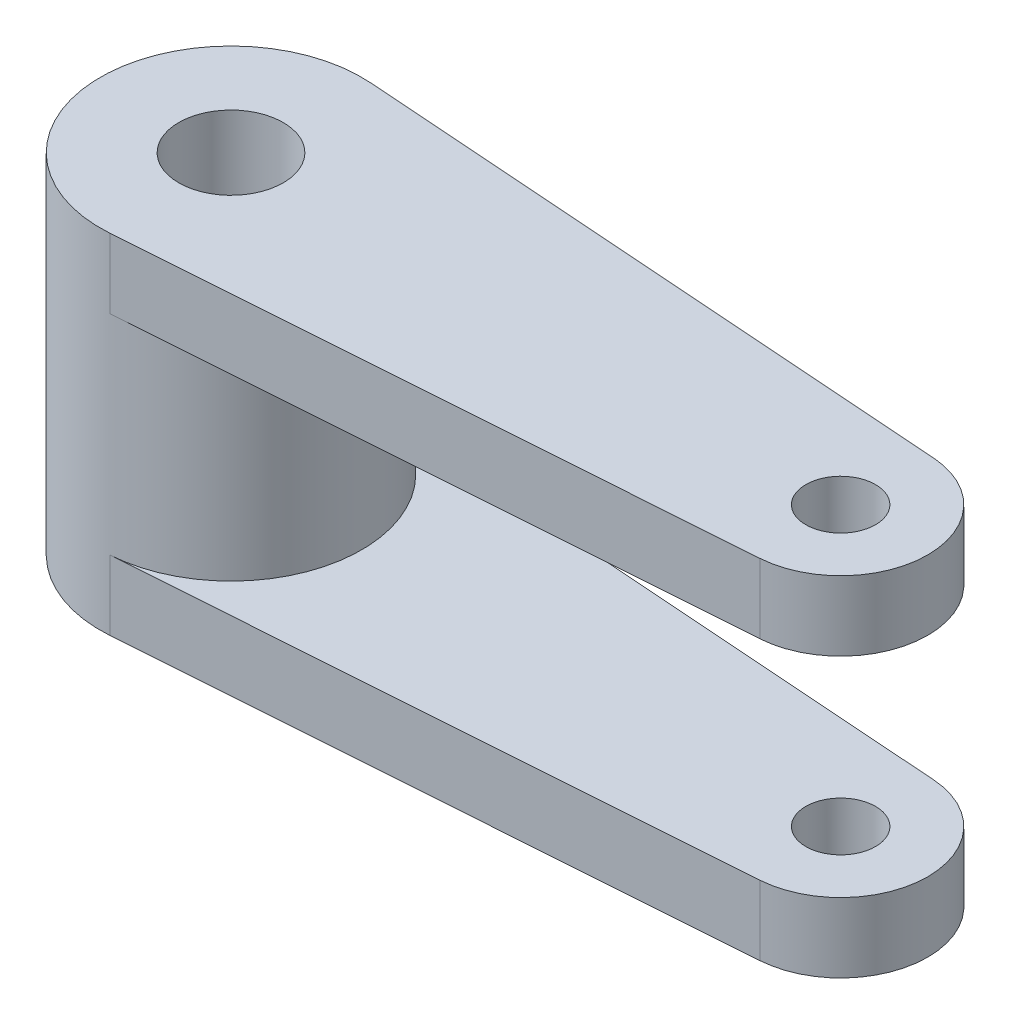
ISO-10303-21;
HEADER;
FILE_DESCRIPTION(('STEP AP214'),'2;1');
FILE_NAME('part.step','',(''),(''),'','','');
FILE_SCHEMA(('AUTOMOTIVE_DESIGN { 1 0 10303 214 1 1 1 1 }'));
ENDSEC;
DATA;
#1=APPLICATION_CONTEXT('core data for automotive mechanical design processes');
#2=APPLICATION_PROTOCOL_DEFINITION('international standard','automotive_design',2000,#1);
#3=PRODUCT_CONTEXT('',#1,'mechanical');
#4=PRODUCT('Part','Part','',(#3));
#5=PRODUCT_RELATED_PRODUCT_CATEGORY('part','',(#4));
#6=PRODUCT_DEFINITION_FORMATION('','',#4);
#7=PRODUCT_DEFINITION_CONTEXT('part definition',#1,'design');
#8=PRODUCT_DEFINITION('design','',#6,#7);
#9=PRODUCT_DEFINITION_SHAPE('','',#8);
#10=(LENGTH_UNIT() NAMED_UNIT(*) SI_UNIT(.MILLI.,.METRE.));
#11=(NAMED_UNIT(*) PLANE_ANGLE_UNIT() SI_UNIT($,.RADIAN.));
#12=(NAMED_UNIT(*) SI_UNIT($,.STERADIAN.) SOLID_ANGLE_UNIT());
#13=UNCERTAINTY_MEASURE_WITH_UNIT(LENGTH_MEASURE(1.E-05),#10,'distance_accuracy_value','');
#14=(GEOMETRIC_REPRESENTATION_CONTEXT(3) GLOBAL_UNCERTAINTY_ASSIGNED_CONTEXT((#13)) GLOBAL_UNIT_ASSIGNED_CONTEXT((#10,
#11,#12)) REPRESENTATION_CONTEXT('',''));
#15=CARTESIAN_POINT('',(0.,0.,0.));
#16=DIRECTION('',(0.,0.,1.));
#17=DIRECTION('',(1.,0.,0.));
#18=AXIS2_PLACEMENT_3D('',#15,#16,#17);
#19=CARTESIAN_POINT('',(0.,20.,0.));
#20=DIRECTION('',(0.,-1.,0.));
#21=DIRECTION('',(0.,0.,-1.));
#22=AXIS2_PLACEMENT_3D('',#19,#20,#21);
#23=CYLINDRICAL_SURFACE('',#22,15.);
#24=CARTESIAN_POINT('',(0.,20.,0.));
#25=DIRECTION('',(0.,1.,0.));
#26=DIRECTION('',(0.,0.,1.));
#27=AXIS2_PLACEMENT_3D('',#24,#25,#26);
#28=CIRCLE('',#27,15.);
#29=CARTESIAN_POINT('',(1.07142857142857,20.,-14.961685761181));
#30=VERTEX_POINT('',#29);
#31=CARTESIAN_POINT('',(1.07142857142857,20.,14.961685761181));
#32=VERTEX_POINT('',#31);
#33=EDGE_CURVE('E140',#30,#32,#28,.T.);
#34=ORIENTED_EDGE('',*,*,#33,.F.);
#35=DIRECTION('',(0.,1.,0.));
#36=VECTOR('',#35,1.);
#37=CARTESIAN_POINT('',(1.07142857142857,12.,-14.961685761181));
#38=LINE('',#37,#36);
#39=CARTESIAN_POINT('',(1.07142857142857,12.,-14.961685761181));
#40=VERTEX_POINT('',#39);
#41=EDGE_CURVE('E133',#40,#30,#38,.T.);
#42=ORIENTED_EDGE('',*,*,#41,.F.);
#43=CARTESIAN_POINT('',(0.,12.,0.));
#44=DIRECTION('',(0.,1.,0.));
#45=DIRECTION('',(0.,0.,1.));
#46=AXIS2_PLACEMENT_3D('',#43,#44,#45);
#47=CIRCLE('',#46,15.);
#48=CARTESIAN_POINT('',(1.07142857142857,12.,14.961685761181));
#49=VERTEX_POINT('',#48);
#50=EDGE_CURVE('E11',#49,#40,#47,.T.);
#51=ORIENTED_EDGE('',*,*,#50,.F.);
#52=DIRECTION('',(0.,1.,0.));
#53=VECTOR('',#52,1.);
#54=CARTESIAN_POINT('',(1.07142857142857,12.,14.961685761181));
#55=LINE('',#54,#53);
#56=EDGE_CURVE('E216',#49,#32,#55,.T.);
#57=ORIENTED_EDGE('',*,*,#56,.T.);
#58=EDGE_LOOP('',(#34,#42,#51,#57));
#59=FACE_BOUND('',#58,.T.);
#60=CARTESIAN_POINT('',(0.,-12.,0.));
#61=DIRECTION('',(0.,-1.,0.));
#62=DIRECTION('',(0.,0.,-1.));
#63=AXIS2_PLACEMENT_3D('',#60,#61,#62);
#64=CIRCLE('',#63,15.);
#65=CARTESIAN_POINT('',(1.07142857142857,-12.,-14.961685761181));
#66=VERTEX_POINT('',#65);
#67=CARTESIAN_POINT('',(1.07142857142857,-12.,14.961685761181));
#68=VERTEX_POINT('',#67);
#69=EDGE_CURVE('E61',#66,#68,#64,.T.);
#70=ORIENTED_EDGE('',*,*,#69,.F.);
#71=DIRECTION('',(0.,-1.,0.));
#72=VECTOR('',#71,1.);
#73=CARTESIAN_POINT('',(1.07142857142857,-12.,-14.961685761181));
#74=LINE('',#73,#72);
#75=CARTESIAN_POINT('',(1.07142857142857,-20.,-14.961685761181));
#76=VERTEX_POINT('',#75);
#77=EDGE_CURVE('E163',#66,#76,#74,.T.);
#78=ORIENTED_EDGE('',*,*,#77,.T.);
#79=CARTESIAN_POINT('',(0.,-20.,0.));
#80=DIRECTION('',(0.,1.,0.));
#81=DIRECTION('',(0.,0.,1.));
#82=AXIS2_PLACEMENT_3D('',#79,#80,#81);
#83=CIRCLE('',#82,15.);
#84=CARTESIAN_POINT('',(1.07142857142857,-20.,14.961685761181));
#85=VERTEX_POINT('',#84);
#86=EDGE_CURVE('E184',#76,#85,#83,.T.);
#87=ORIENTED_EDGE('',*,*,#86,.T.);
#88=DIRECTION('',(0.,-1.,0.));
#89=VECTOR('',#88,1.);
#90=CARTESIAN_POINT('',(1.07142857142857,-12.,14.961685761181));
#91=LINE('',#90,#89);
#92=EDGE_CURVE('E180',#68,#85,#91,.T.);
#93=ORIENTED_EDGE('',*,*,#92,.F.);
#94=EDGE_LOOP('',(#70,#78,#87,#93));
#95=FACE_BOUND('',#94,.T.);
#96=ADVANCED_FACE('F51',(#59,#95),#23,.T.);
#97=CARTESIAN_POINT('',(0.,20.,0.));
#98=DIRECTION('',(0.,1.,0.));
#99=DIRECTION('',(0.,0.,1.));
#100=AXIS2_PLACEMENT_3D('',#97,#98,#99);
#101=PLANE('',#100);
#102=CARTESIAN_POINT('',(70.,20.,0.));
#103=DIRECTION('',(0.,1.,0.));
#104=DIRECTION('',(0.,0.,1.));
#105=AXIS2_PLACEMENT_3D('',#102,#103,#104);
#106=CIRCLE('',#105,4.);
#107=CARTESIAN_POINT('',(70.,20.,4.));
#108=VERTEX_POINT('',#107);
#109=EDGE_CURVE('E193',#108,#108,#106,.T.);
#110=ORIENTED_EDGE('',*,*,#109,.F.);
#111=EDGE_LOOP('',(#110));
#112=FACE_BOUND('',#111,.T.);
#113=CARTESIAN_POINT('',(0.,20.,0.));
#114=DIRECTION('',(0.,1.,0.));
#115=DIRECTION('',(0.,0.,1.));
#116=AXIS2_PLACEMENT_3D('',#113,#114,#115);
#117=CIRCLE('',#116,6.);
#118=CARTESIAN_POINT('',(0.,20.,6.));
#119=VERTEX_POINT('',#118);
#120=EDGE_CURVE('E192',#119,#119,#117,.T.);
#121=ORIENTED_EDGE('',*,*,#120,.F.);
#122=EDGE_LOOP('',(#121));
#123=FACE_BOUND('',#122,.T.);
#124=ORIENTED_EDGE('',*,*,#33,.T.);
#125=DIRECTION('',(0.997445717412067,0.,-0.0714285714285715));
#126=VECTOR('',#125,1.);
#127=CARTESIAN_POINT('',(70.7142857142857,20.,9.97445717412067));
#128=LINE('',#127,#126);
#129=CARTESIAN_POINT('',(70.7142857142857,20.,9.97445717412067));
#130=VERTEX_POINT('',#129);
#131=EDGE_CURVE('E138',#32,#130,#128,.T.);
#132=ORIENTED_EDGE('',*,*,#131,.T.);
#133=CARTESIAN_POINT('',(70.,20.,0.));
#134=DIRECTION('',(0.,1.,0.));
#135=DIRECTION('',(0.,0.,-1.));
#136=AXIS2_PLACEMENT_3D('',#133,#134,#135);
#137=CIRCLE('',#136,10.);
#138=CARTESIAN_POINT('',(70.7142857142857,20.,-9.97445717412067));
#139=VERTEX_POINT('',#138);
#140=EDGE_CURVE('E219',#130,#139,#137,.T.);
#141=ORIENTED_EDGE('',*,*,#140,.T.);
#142=DIRECTION('',(-0.997445717412067,0.,-0.0714285714285715));
#143=VECTOR('',#142,1.);
#144=CARTESIAN_POINT('',(1.07142857142857,20.,-14.961685761181));
#145=LINE('',#144,#143);
#146=EDGE_CURVE('E69',#139,#30,#145,.T.);
#147=ORIENTED_EDGE('',*,*,#146,.T.);
#148=EDGE_LOOP('',(#124,#132,#141,#147));
#149=FACE_BOUND('',#148,.T.);
#150=ADVANCED_FACE('F231',(#112,#123,#149),#101,.T.);
#151=CARTESIAN_POINT('',(0.,-20.,0.));
#152=DIRECTION('',(0.,1.,0.));
#153=DIRECTION('',(0.,0.,1.));
#154=AXIS2_PLACEMENT_3D('',#151,#152,#153);
#155=PLANE('',#154);
#156=CARTESIAN_POINT('',(70.,-20.,0.));
#157=DIRECTION('',(0.,1.,0.));
#158=DIRECTION('',(0.,0.,1.));
#159=AXIS2_PLACEMENT_3D('',#156,#157,#158);
#160=CIRCLE('',#159,4.);
#161=CARTESIAN_POINT('',(70.,-20.,4.));
#162=VERTEX_POINT('',#161);
#163=EDGE_CURVE('E202',#162,#162,#160,.T.);
#164=ORIENTED_EDGE('',*,*,#163,.T.);
#165=EDGE_LOOP('',(#164));
#166=FACE_BOUND('',#165,.T.);
#167=CARTESIAN_POINT('',(0.,-20.,0.));
#168=DIRECTION('',(0.,1.,0.));
#169=DIRECTION('',(0.,0.,1.));
#170=AXIS2_PLACEMENT_3D('',#167,#168,#169);
#171=CIRCLE('',#170,6.);
#172=CARTESIAN_POINT('',(0.,-20.,6.));
#173=VERTEX_POINT('',#172);
#174=EDGE_CURVE('E189',#173,#173,#171,.T.);
#175=ORIENTED_EDGE('',*,*,#174,.T.);
#176=EDGE_LOOP('',(#175));
#177=FACE_BOUND('',#176,.T.);
#178=ORIENTED_EDGE('',*,*,#86,.F.);
#179=DIRECTION('',(-0.997445717412067,0.,-0.0714285714285715));
#180=VECTOR('',#179,1.);
#181=CARTESIAN_POINT('',(1.07142857142857,-20.,-14.961685761181));
#182=LINE('',#181,#180);
#183=CARTESIAN_POINT('',(70.7142857142857,-20.,-9.97445717412067));
#184=VERTEX_POINT('',#183);
#185=EDGE_CURVE('E158',#184,#76,#182,.T.);
#186=ORIENTED_EDGE('',*,*,#185,.F.);
#187=CARTESIAN_POINT('',(70.,-20.,0.));
#188=DIRECTION('',(0.,1.,0.));
#189=DIRECTION('',(0.,0.,-1.));
#190=AXIS2_PLACEMENT_3D('',#187,#188,#189);
#191=CIRCLE('',#190,10.);
#192=CARTESIAN_POINT('',(70.7142857142857,-20.,9.97445717412067));
#193=VERTEX_POINT('',#192);
#194=EDGE_CURVE('E147',#193,#184,#191,.T.);
#195=ORIENTED_EDGE('',*,*,#194,.F.);
#196=DIRECTION('',(0.997445717412067,0.,-0.0714285714285715));
#197=VECTOR('',#196,1.);
#198=CARTESIAN_POINT('',(70.7142857142857,-20.,9.97445717412067));
#199=LINE('',#198,#197);
#200=EDGE_CURVE('E142',#85,#193,#199,.T.);
#201=ORIENTED_EDGE('',*,*,#200,.F.);
#202=EDGE_LOOP('',(#178,#186,#195,#201));
#203=FACE_BOUND('',#202,.T.);
#204=ADVANCED_FACE('F233',(#166,#177,#203),#155,.F.);
#205=CARTESIAN_POINT('',(0.,-12.,0.));
#206=DIRECTION('',(0.,-1.,0.));
#207=DIRECTION('',(0.,0.,-1.));
#208=AXIS2_PLACEMENT_3D('',#205,#206,#207);
#209=PLANE('',#208);
#210=CARTESIAN_POINT('',(70.,-12.,0.));
#211=DIRECTION('',(0.,-1.,0.));
#212=DIRECTION('',(0.,0.,-1.));
#213=AXIS2_PLACEMENT_3D('',#210,#211,#212);
#214=CIRCLE('',#213,4.);
#215=CARTESIAN_POINT('',(70.,-12.,-4.));
#216=VERTEX_POINT('',#215);
#217=EDGE_CURVE('E208',#216,#216,#214,.T.);
#218=ORIENTED_EDGE('',*,*,#217,.T.);
#219=EDGE_LOOP('',(#218));
#220=FACE_BOUND('',#219,.T.);
#221=DIRECTION('',(-0.997445717412067,0.,-0.0714285714285715));
#222=VECTOR('',#221,1.);
#223=CARTESIAN_POINT('',(1.07142857142857,-12.,-14.961685761181));
#224=LINE('',#223,#222);
#225=CARTESIAN_POINT('',(70.7142857142857,-12.,-9.97445717412067));
#226=VERTEX_POINT('',#225);
#227=EDGE_CURVE('E161',#226,#66,#224,.T.);
#228=ORIENTED_EDGE('',*,*,#227,.T.);
#229=ORIENTED_EDGE('',*,*,#69,.T.);
#230=DIRECTION('',(0.997445717412067,0.,-0.0714285714285715));
#231=VECTOR('',#230,1.);
#232=CARTESIAN_POINT('',(70.7142857142857,-12.,9.97445717412067));
#233=LINE('',#232,#231);
#234=CARTESIAN_POINT('',(70.7142857142857,-12.,9.97445717412067));
#235=VERTEX_POINT('',#234);
#236=EDGE_CURVE('E154',#68,#235,#233,.T.);
#237=ORIENTED_EDGE('',*,*,#236,.T.);
#238=CARTESIAN_POINT('',(70.,-12.,0.));
#239=DIRECTION('',(0.,1.,0.));
#240=DIRECTION('',(0.,0.,-1.));
#241=AXIS2_PLACEMENT_3D('',#238,#239,#240);
#242=CIRCLE('',#241,10.);
#243=EDGE_CURVE('E157',#235,#226,#242,.T.);
#244=ORIENTED_EDGE('',*,*,#243,.T.);
#245=EDGE_LOOP('',(#228,#229,#237,#244));
#246=FACE_BOUND('',#245,.T.);
#247=ADVANCED_FACE('F239',(#220,#246),#209,.F.);
#248=CARTESIAN_POINT('',(70.7142857142857,-12.,9.97445717412067));
#249=DIRECTION('',(-0.0714285714285715,0.,-0.997445717412067));
#250=DIRECTION('',(-0.997445717412067,0.,0.0714285714285715));
#251=AXIS2_PLACEMENT_3D('',#248,#249,#250);
#252=PLANE('',#251);
#253=ORIENTED_EDGE('',*,*,#200,.T.);
#254=DIRECTION('',(0.,-1.,0.));
#255=VECTOR('',#254,1.);
#256=CARTESIAN_POINT('',(70.7142857142857,-12.,9.97445717412067));
#257=LINE('',#256,#255);
#258=EDGE_CURVE('E176',#235,#193,#257,.T.);
#259=ORIENTED_EDGE('',*,*,#258,.F.);
#260=ORIENTED_EDGE('',*,*,#236,.F.);
#261=ORIENTED_EDGE('',*,*,#92,.T.);
#262=EDGE_LOOP('',(#253,#259,#260,#261));
#263=FACE_BOUND('',#262,.T.);
#264=ADVANCED_FACE('F246',(#263),#252,.F.);
#265=CARTESIAN_POINT('',(70.,-12.,0.));
#266=DIRECTION('',(0.,-1.,0.));
#267=DIRECTION('',(0.,0.,-1.));
#268=AXIS2_PLACEMENT_3D('',#265,#266,#267);
#269=CYLINDRICAL_SURFACE('',#268,10.);
#270=ORIENTED_EDGE('',*,*,#194,.T.);
#271=DIRECTION('',(0.,-1.,0.));
#272=VECTOR('',#271,1.);
#273=CARTESIAN_POINT('',(70.7142857142857,-12.,-9.97445717412067));
#274=LINE('',#273,#272);
#275=EDGE_CURVE('E172',#226,#184,#274,.T.);
#276=ORIENTED_EDGE('',*,*,#275,.F.);
#277=ORIENTED_EDGE('',*,*,#243,.F.);
#278=ORIENTED_EDGE('',*,*,#258,.T.);
#279=EDGE_LOOP('',(#270,#276,#277,#278));
#280=FACE_BOUND('',#279,.T.);
#281=ADVANCED_FACE('F254',(#280),#269,.T.);
#282=CARTESIAN_POINT('',(1.07142857142857,-12.,-14.961685761181));
#283=DIRECTION('',(-0.0714285714285715,0.,0.997445717412067));
#284=DIRECTION('',(0.997445717412067,0.,0.0714285714285715));
#285=AXIS2_PLACEMENT_3D('',#282,#283,#284);
#286=PLANE('',#285);
#287=ORIENTED_EDGE('',*,*,#185,.T.);
#288=ORIENTED_EDGE('',*,*,#77,.F.);
#289=ORIENTED_EDGE('',*,*,#227,.F.);
#290=ORIENTED_EDGE('',*,*,#275,.T.);
#291=EDGE_LOOP('',(#287,#288,#289,#290));
#292=FACE_BOUND('',#291,.T.);
#293=ADVANCED_FACE('F256',(#292),#286,.F.);
#294=CARTESIAN_POINT('',(0.,12.,0.));
#295=DIRECTION('',(0.,1.,0.));
#296=DIRECTION('',(0.,0.,-1.));
#297=AXIS2_PLACEMENT_3D('',#294,#295,#296);
#298=PLANE('',#297);
#299=CARTESIAN_POINT('',(70.,12.,0.));
#300=DIRECTION('',(0.,1.,0.));
#301=DIRECTION('',(0.,0.,1.));
#302=AXIS2_PLACEMENT_3D('',#299,#300,#301);
#303=CIRCLE('',#302,4.);
#304=CARTESIAN_POINT('',(70.,12.,4.));
#305=VERTEX_POINT('',#304);
#306=EDGE_CURVE('E55',#305,#305,#303,.T.);
#307=ORIENTED_EDGE('',*,*,#306,.T.);
#308=EDGE_LOOP('',(#307));
#309=FACE_BOUND('',#308,.T.);
#310=DIRECTION('',(0.997445717412067,0.,-0.0714285714285715));
#311=VECTOR('',#310,1.);
#312=CARTESIAN_POINT('',(70.7142857142857,12.,9.97445717412067));
#313=LINE('',#312,#311);
#314=CARTESIAN_POINT('',(70.7142857142857,12.,9.97445717412067));
#315=VERTEX_POINT('',#314);
#316=EDGE_CURVE('E127',#49,#315,#313,.T.);
#317=ORIENTED_EDGE('',*,*,#316,.F.);
#318=ORIENTED_EDGE('',*,*,#50,.T.);
#319=DIRECTION('',(-0.997445717412067,0.,-0.0714285714285715));
#320=VECTOR('',#319,1.);
#321=CARTESIAN_POINT('',(1.07142857142857,12.,-14.961685761181));
#322=LINE('',#321,#320);
#323=CARTESIAN_POINT('',(70.7142857142857,12.,-9.97445717412067));
#324=VERTEX_POINT('',#323);
#325=EDGE_CURVE('E124',#324,#40,#322,.T.);
#326=ORIENTED_EDGE('',*,*,#325,.F.);
#327=CARTESIAN_POINT('',(70.,12.,0.));
#328=DIRECTION('',(0.,1.,0.));
#329=DIRECTION('',(0.,0.,-1.));
#330=AXIS2_PLACEMENT_3D('',#327,#328,#329);
#331=CIRCLE('',#330,10.);
#332=EDGE_CURVE('E137',#315,#324,#331,.T.);
#333=ORIENTED_EDGE('',*,*,#332,.F.);
#334=EDGE_LOOP('',(#317,#318,#326,#333));
#335=FACE_BOUND('',#334,.T.);
#336=ADVANCED_FACE('F122',(#309,#335),#298,.F.);
#337=CARTESIAN_POINT('',(1.07142857142857,12.,-14.961685761181));
#338=DIRECTION('',(0.0714285714285715,0.,-0.997445717412067));
#339=DIRECTION('',(-0.997445717412067,0.,-0.0714285714285715));
#340=AXIS2_PLACEMENT_3D('',#337,#338,#339);
#341=PLANE('',#340);
#342=ORIENTED_EDGE('',*,*,#146,.F.);
#343=DIRECTION('',(0.,1.,0.));
#344=VECTOR('',#343,1.);
#345=CARTESIAN_POINT('',(70.7142857142857,12.,-9.97445717412067));
#346=LINE('',#345,#344);
#347=EDGE_CURVE('E135',#324,#139,#346,.T.);
#348=ORIENTED_EDGE('',*,*,#347,.F.);
#349=ORIENTED_EDGE('',*,*,#325,.T.);
#350=ORIENTED_EDGE('',*,*,#41,.T.);
#351=EDGE_LOOP('',(#342,#348,#349,#350));
#352=FACE_BOUND('',#351,.T.);
#353=ADVANCED_FACE('F132',(#352),#341,.T.);
#354=CARTESIAN_POINT('',(70.,12.,0.));
#355=DIRECTION('',(0.,1.,0.));
#356=DIRECTION('',(0.,0.,1.));
#357=AXIS2_PLACEMENT_3D('',#354,#355,#356);
#358=CYLINDRICAL_SURFACE('',#357,10.);
#359=ORIENTED_EDGE('',*,*,#140,.F.);
#360=DIRECTION('',(0.,1.,0.));
#361=VECTOR('',#360,1.);
#362=CARTESIAN_POINT('',(70.7142857142857,12.,9.97445717412067));
#363=LINE('',#362,#361);
#364=EDGE_CURVE('E150',#315,#130,#363,.T.);
#365=ORIENTED_EDGE('',*,*,#364,.F.);
#366=ORIENTED_EDGE('',*,*,#332,.T.);
#367=ORIENTED_EDGE('',*,*,#347,.T.);
#368=EDGE_LOOP('',(#359,#365,#366,#367));
#369=FACE_BOUND('',#368,.T.);
#370=ADVANCED_FACE('F230',(#369),#358,.T.);
#371=CARTESIAN_POINT('',(70.7142857142857,12.,9.97445717412067));
#372=DIRECTION('',(0.0714285714285715,0.,0.997445717412067));
#373=DIRECTION('',(0.997445717412067,0.,-0.0714285714285715));
#374=AXIS2_PLACEMENT_3D('',#371,#372,#373);
#375=PLANE('',#374);
#376=ORIENTED_EDGE('',*,*,#131,.F.);
#377=ORIENTED_EDGE('',*,*,#56,.F.);
#378=ORIENTED_EDGE('',*,*,#316,.T.);
#379=ORIENTED_EDGE('',*,*,#364,.T.);
#380=EDGE_LOOP('',(#376,#377,#378,#379));
#381=FACE_BOUND('',#380,.T.);
#382=ADVANCED_FACE('F228',(#381),#375,.T.);
#383=CARTESIAN_POINT('',(0.,-96.,0.));
#384=DIRECTION('',(0.,1.,0.));
#385=DIRECTION('',(0.,0.,1.));
#386=AXIS2_PLACEMENT_3D('',#383,#384,#385);
#387=CYLINDRICAL_SURFACE('',#386,6.);
#388=ORIENTED_EDGE('',*,*,#120,.T.);
#389=EDGE_LOOP('',(#388));
#390=FACE_BOUND('',#389,.T.);
#391=ORIENTED_EDGE('',*,*,#174,.F.);
#392=EDGE_LOOP('',(#391));
#393=FACE_BOUND('',#392,.T.);
#394=ADVANCED_FACE('F266',(#390,#393),#387,.F.);
#395=CARTESIAN_POINT('',(70.,-96.,0.));
#396=DIRECTION('',(0.,1.,0.));
#397=DIRECTION('',(0.,0.,1.));
#398=AXIS2_PLACEMENT_3D('',#395,#396,#397);
#399=CYLINDRICAL_SURFACE('',#398,4.);
#400=ORIENTED_EDGE('',*,*,#109,.T.);
#401=EDGE_LOOP('',(#400));
#402=FACE_BOUND('',#401,.T.);
#403=ORIENTED_EDGE('',*,*,#306,.F.);
#404=EDGE_LOOP('',(#403));
#405=FACE_BOUND('',#404,.T.);
#406=ADVANCED_FACE('F270',(#402,#405),#399,.F.);
#407=ORIENTED_EDGE('',*,*,#217,.F.);
#408=EDGE_LOOP('',(#407));
#409=FACE_BOUND('',#408,.T.);
#410=ORIENTED_EDGE('',*,*,#163,.F.);
#411=EDGE_LOOP('',(#410));
#412=FACE_BOUND('',#411,.T.);
#413=ADVANCED_FACE('F268',(#409,#412),#399,.F.);
#414=CLOSED_SHELL('',(#96,#150,#204,#247,#264,#281,#293,#336,#353,#370,#382,#394,#406,#413));
#415=MANIFOLD_SOLID_BREP('B2',#414);
#416=ADVANCED_BREP_SHAPE_REPRESENTATION('',(#18,#415),#14);
#417=SHAPE_DEFINITION_REPRESENTATION(#9,#416);
ENDSEC;
END-ISO-10303-21;
